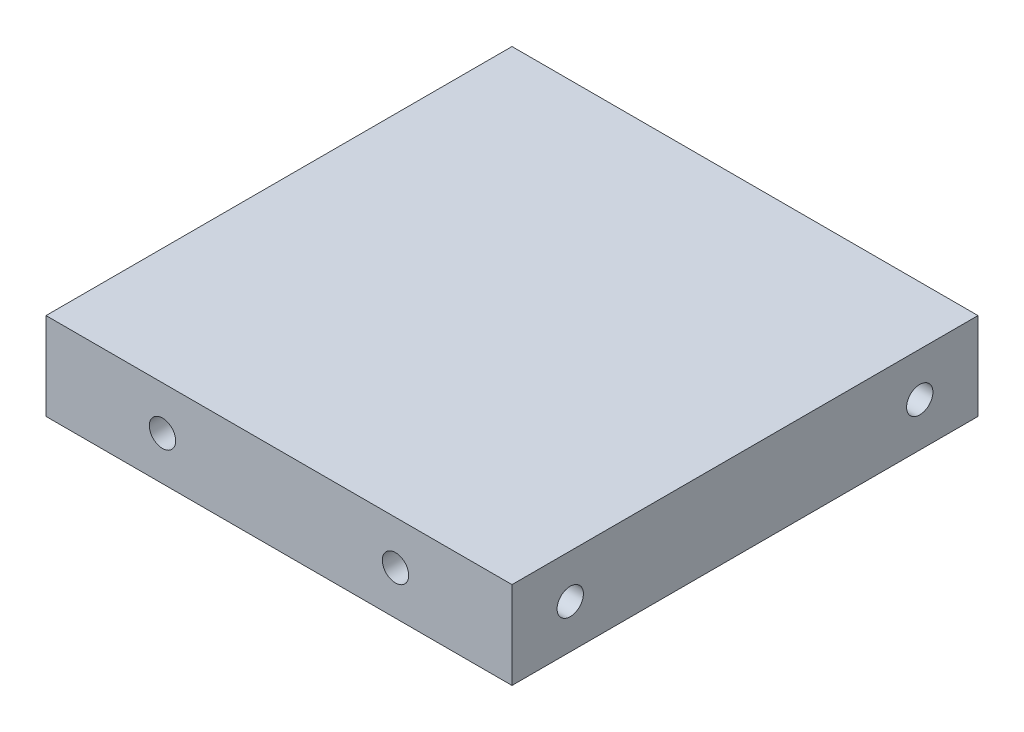
ISO-10303-21;
HEADER;
FILE_DESCRIPTION(('STEP AP214'),'2;1');
FILE_NAME('part.step','',(''),(''),'','','');
FILE_SCHEMA(('AUTOMOTIVE_DESIGN { 1 0 10303 214 1 1 1 1 }'));
ENDSEC;
DATA;
#1=APPLICATION_CONTEXT('core data for automotive mechanical design processes');
#2=APPLICATION_PROTOCOL_DEFINITION('international standard','automotive_design',2000,#1);
#3=PRODUCT_CONTEXT('',#1,'mechanical');
#4=PRODUCT('Part','Part','',(#3));
#5=PRODUCT_RELATED_PRODUCT_CATEGORY('part','',(#4));
#6=PRODUCT_DEFINITION_FORMATION('','',#4);
#7=PRODUCT_DEFINITION_CONTEXT('part definition',#1,'design');
#8=PRODUCT_DEFINITION('design','',#6,#7);
#9=PRODUCT_DEFINITION_SHAPE('','',#8);
#10=(LENGTH_UNIT() NAMED_UNIT(*) SI_UNIT(.MILLI.,.METRE.));
#11=(NAMED_UNIT(*) PLANE_ANGLE_UNIT() SI_UNIT($,.RADIAN.));
#12=(NAMED_UNIT(*) SI_UNIT($,.STERADIAN.) SOLID_ANGLE_UNIT());
#13=UNCERTAINTY_MEASURE_WITH_UNIT(LENGTH_MEASURE(1.E-05),#10,'distance_accuracy_value','');
#14=(GEOMETRIC_REPRESENTATION_CONTEXT(3) GLOBAL_UNCERTAINTY_ASSIGNED_CONTEXT((#13)) GLOBAL_UNIT_ASSIGNED_CONTEXT((#10,
#11,#12)) REPRESENTATION_CONTEXT('',''));
#15=CARTESIAN_POINT('',(0.,0.,0.));
#16=DIRECTION('',(0.,0.,1.));
#17=DIRECTION('',(1.,0.,0.));
#18=AXIS2_PLACEMENT_3D('',#15,#16,#17);
#19=CARTESIAN_POINT('',(-20.,7.5,20.));
#20=DIRECTION('',(1.,0.,0.));
#21=DIRECTION('',(0.,0.,-1.));
#22=AXIS2_PLACEMENT_3D('',#19,#20,#21);
#23=PLANE('',#22);
#24=CARTESIAN_POINT('',(-20.,3.75,-15.));
#25=DIRECTION('',(-1.,0.,0.));
#26=DIRECTION('',(0.,0.,1.));
#27=AXIS2_PLACEMENT_3D('',#24,#25,#26);
#28=CIRCLE('',#27,1.13029999999999);
#29=CARTESIAN_POINT('',(-20.,3.75,-13.8697));
#30=VERTEX_POINT('',#29);
#31=EDGE_CURVE('E157',#30,#30,#28,.T.);
#32=ORIENTED_EDGE('',*,*,#31,.F.);
#33=EDGE_LOOP('',(#32));
#34=FACE_BOUND('',#33,.T.);
#35=CARTESIAN_POINT('',(-20.,3.75000000000001,15.));
#36=DIRECTION('',(-1.,0.,0.));
#37=DIRECTION('',(0.,0.,1.));
#38=AXIS2_PLACEMENT_3D('',#35,#36,#37);
#39=CIRCLE('',#38,1.13029999999999);
#40=CARTESIAN_POINT('',(-20.,3.75000000000001,16.1303));
#41=VERTEX_POINT('',#40);
#42=EDGE_CURVE('E163',#41,#41,#39,.T.);
#43=ORIENTED_EDGE('',*,*,#42,.F.);
#44=EDGE_LOOP('',(#43));
#45=FACE_BOUND('',#44,.T.);
#46=DIRECTION('',(0.,0.,1.));
#47=VECTOR('',#46,1.);
#48=CARTESIAN_POINT('',(-20.,0.,20.));
#49=LINE('',#48,#47);
#50=CARTESIAN_POINT('',(-20.,0.,-20.));
#51=VERTEX_POINT('',#50);
#52=CARTESIAN_POINT('',(-20.,0.,20.));
#53=VERTEX_POINT('',#52);
#54=EDGE_CURVE('E169',#51,#53,#49,.T.);
#55=ORIENTED_EDGE('',*,*,#54,.T.);
#56=DIRECTION('',(0.,-1.,0.));
#57=VECTOR('',#56,1.);
#58=CARTESIAN_POINT('',(-20.,7.5,20.));
#59=LINE('',#58,#57);
#60=CARTESIAN_POINT('',(-20.,7.5,20.));
#61=VERTEX_POINT('',#60);
#62=EDGE_CURVE('E11',#61,#53,#59,.T.);
#63=ORIENTED_EDGE('',*,*,#62,.F.);
#64=DIRECTION('',(0.,0.,1.));
#65=VECTOR('',#64,1.);
#66=CARTESIAN_POINT('',(-20.,7.5,20.));
#67=LINE('',#66,#65);
#68=CARTESIAN_POINT('',(-20.,7.5,-20.));
#69=VERTEX_POINT('',#68);
#70=EDGE_CURVE('E170',#69,#61,#67,.T.);
#71=ORIENTED_EDGE('',*,*,#70,.F.);
#72=DIRECTION('',(0.,-1.,0.));
#73=VECTOR('',#72,1.);
#74=CARTESIAN_POINT('',(-20.,7.5,-20.));
#75=LINE('',#74,#73);
#76=EDGE_CURVE('E176',#69,#51,#75,.T.);
#77=ORIENTED_EDGE('',*,*,#76,.T.);
#78=EDGE_LOOP('',(#55,#63,#71,#77));
#79=FACE_BOUND('',#78,.T.);
#80=ADVANCED_FACE('F40',(#34,#45,#79),#23,.F.);
#81=CARTESIAN_POINT('',(20.,7.5,20.));
#82=DIRECTION('',(0.,0.,-1.));
#83=DIRECTION('',(-1.,0.,0.));
#84=AXIS2_PLACEMENT_3D('',#81,#82,#83);
#85=PLANE('',#84);
#86=CARTESIAN_POINT('',(-10.,3.75,20.));
#87=DIRECTION('',(0.,0.,1.));
#88=DIRECTION('',(1.,0.,0.));
#89=AXIS2_PLACEMENT_3D('',#86,#87,#88);
#90=CIRCLE('',#89,1.13029999999999);
#91=CARTESIAN_POINT('',(-8.86970000000002,3.75,20.));
#92=VERTEX_POINT('',#91);
#93=EDGE_CURVE('E123',#92,#92,#90,.T.);
#94=ORIENTED_EDGE('',*,*,#93,.F.);
#95=EDGE_LOOP('',(#94));
#96=FACE_BOUND('',#95,.T.);
#97=CARTESIAN_POINT('',(9.99999999999999,3.75,20.));
#98=DIRECTION('',(0.,0.,1.));
#99=DIRECTION('',(1.,0.,0.));
#100=AXIS2_PLACEMENT_3D('',#97,#98,#99);
#101=CIRCLE('',#100,1.13029999999999);
#102=CARTESIAN_POINT('',(11.1303,3.75,20.));
#103=VERTEX_POINT('',#102);
#104=EDGE_CURVE('E122',#103,#103,#101,.T.);
#105=ORIENTED_EDGE('',*,*,#104,.F.);
#106=EDGE_LOOP('',(#105));
#107=FACE_BOUND('',#106,.T.);
#108=DIRECTION('',(1.,0.,0.));
#109=VECTOR('',#108,1.);
#110=CARTESIAN_POINT('',(20.,0.,20.));
#111=LINE('',#110,#109);
#112=CARTESIAN_POINT('',(20.,0.,20.));
#113=VERTEX_POINT('',#112);
#114=EDGE_CURVE('E179',#53,#113,#111,.T.);
#115=ORIENTED_EDGE('',*,*,#114,.T.);
#116=DIRECTION('',(0.,-1.,0.));
#117=VECTOR('',#116,1.);
#118=CARTESIAN_POINT('',(20.,7.5,20.));
#119=LINE('',#118,#117);
#120=CARTESIAN_POINT('',(20.,7.5,20.));
#121=VERTEX_POINT('',#120);
#122=EDGE_CURVE('E48',#121,#113,#119,.T.);
#123=ORIENTED_EDGE('',*,*,#122,.F.);
#124=DIRECTION('',(1.,0.,0.));
#125=VECTOR('',#124,1.);
#126=CARTESIAN_POINT('',(20.,7.5,20.));
#127=LINE('',#126,#125);
#128=EDGE_CURVE('E87',#61,#121,#127,.T.);
#129=ORIENTED_EDGE('',*,*,#128,.F.);
#130=ORIENTED_EDGE('',*,*,#62,.T.);
#131=EDGE_LOOP('',(#115,#123,#129,#130));
#132=FACE_BOUND('',#131,.T.);
#133=ADVANCED_FACE('F203',(#96,#107,#132),#85,.F.);
#134=CARTESIAN_POINT('',(20.,7.5,20.));
#135=DIRECTION('',(-1.,0.,0.));
#136=DIRECTION('',(0.,0.,1.));
#137=AXIS2_PLACEMENT_3D('',#134,#135,#136);
#138=PLANE('',#137);
#139=CARTESIAN_POINT('',(20.,3.75000000000001,15.));
#140=DIRECTION('',(1.,0.,0.));
#141=DIRECTION('',(0.,0.,-1.));
#142=AXIS2_PLACEMENT_3D('',#139,#140,#141);
#143=CIRCLE('',#142,1.13029999999999);
#144=CARTESIAN_POINT('',(20.,3.75000000000001,13.8697));
#145=VERTEX_POINT('',#144);
#146=EDGE_CURVE('E145',#145,#145,#143,.T.);
#147=ORIENTED_EDGE('',*,*,#146,.F.);
#148=EDGE_LOOP('',(#147));
#149=FACE_BOUND('',#148,.T.);
#150=CARTESIAN_POINT('',(20.,3.75,-15.));
#151=DIRECTION('',(1.,0.,0.));
#152=DIRECTION('',(0.,0.,-1.));
#153=AXIS2_PLACEMENT_3D('',#150,#151,#152);
#154=CIRCLE('',#153,1.13029999999999);
#155=CARTESIAN_POINT('',(20.,3.75,-16.1303));
#156=VERTEX_POINT('',#155);
#157=EDGE_CURVE('E151',#156,#156,#154,.T.);
#158=ORIENTED_EDGE('',*,*,#157,.F.);
#159=EDGE_LOOP('',(#158));
#160=FACE_BOUND('',#159,.T.);
#161=DIRECTION('',(0.,0.,-1.));
#162=VECTOR('',#161,1.);
#163=CARTESIAN_POINT('',(20.,0.,20.));
#164=LINE('',#163,#162);
#165=CARTESIAN_POINT('',(20.,0.,-20.));
#166=VERTEX_POINT('',#165);
#167=EDGE_CURVE('E74',#113,#166,#164,.T.);
#168=ORIENTED_EDGE('',*,*,#167,.T.);
#169=DIRECTION('',(0.,-1.,0.));
#170=VECTOR('',#169,1.);
#171=CARTESIAN_POINT('',(20.,7.5,-20.));
#172=LINE('',#171,#170);
#173=CARTESIAN_POINT('',(20.,7.5,-20.));
#174=VERTEX_POINT('',#173);
#175=EDGE_CURVE('E184',#174,#166,#172,.T.);
#176=ORIENTED_EDGE('',*,*,#175,.F.);
#177=DIRECTION('',(0.,0.,-1.));
#178=VECTOR('',#177,1.);
#179=CARTESIAN_POINT('',(20.,7.5,20.));
#180=LINE('',#179,#178);
#181=EDGE_CURVE('E173',#121,#174,#180,.T.);
#182=ORIENTED_EDGE('',*,*,#181,.F.);
#183=ORIENTED_EDGE('',*,*,#122,.T.);
#184=EDGE_LOOP('',(#168,#176,#182,#183));
#185=FACE_BOUND('',#184,.T.);
#186=ADVANCED_FACE('F186',(#149,#160,#185),#138,.F.);
#187=CARTESIAN_POINT('',(20.,7.5,-20.));
#188=DIRECTION('',(0.,0.,1.));
#189=DIRECTION('',(1.,0.,0.));
#190=AXIS2_PLACEMENT_3D('',#187,#188,#189);
#191=PLANE('',#190);
#192=CARTESIAN_POINT('',(9.99999999999999,3.75,-20.));
#193=DIRECTION('',(0.,0.,-1.));
#194=DIRECTION('',(-1.,0.,0.));
#195=AXIS2_PLACEMENT_3D('',#192,#193,#194);
#196=CIRCLE('',#195,1.1303);
#197=CARTESIAN_POINT('',(8.86969999999999,3.75,-20.));
#198=VERTEX_POINT('',#197);
#199=EDGE_CURVE('E133',#198,#198,#196,.T.);
#200=ORIENTED_EDGE('',*,*,#199,.F.);
#201=EDGE_LOOP('',(#200));
#202=FACE_BOUND('',#201,.T.);
#203=CARTESIAN_POINT('',(-10.,3.75,-20.));
#204=DIRECTION('',(0.,0.,-1.));
#205=DIRECTION('',(-1.,0.,0.));
#206=AXIS2_PLACEMENT_3D('',#203,#204,#205);
#207=CIRCLE('',#206,1.1303);
#208=CARTESIAN_POINT('',(-11.1303,3.75,-20.));
#209=VERTEX_POINT('',#208);
#210=EDGE_CURVE('E139',#209,#209,#207,.T.);
#211=ORIENTED_EDGE('',*,*,#210,.F.);
#212=EDGE_LOOP('',(#211));
#213=FACE_BOUND('',#212,.T.);
#214=DIRECTION('',(-1.,0.,0.));
#215=VECTOR('',#214,1.);
#216=CARTESIAN_POINT('',(20.,0.,-20.));
#217=LINE('',#216,#215);
#218=EDGE_CURVE('E80',#166,#51,#217,.T.);
#219=ORIENTED_EDGE('',*,*,#218,.T.);
#220=ORIENTED_EDGE('',*,*,#76,.F.);
#221=DIRECTION('',(-1.,0.,0.));
#222=VECTOR('',#221,1.);
#223=CARTESIAN_POINT('',(20.,7.5,-20.));
#224=LINE('',#223,#222);
#225=EDGE_CURVE('E56',#174,#69,#224,.T.);
#226=ORIENTED_EDGE('',*,*,#225,.F.);
#227=ORIENTED_EDGE('',*,*,#175,.T.);
#228=EDGE_LOOP('',(#219,#220,#226,#227));
#229=FACE_BOUND('',#228,.T.);
#230=ADVANCED_FACE('F193',(#202,#213,#229),#191,.F.);
#231=CARTESIAN_POINT('',(0.,7.5,0.));
#232=DIRECTION('',(0.,1.,0.));
#233=DIRECTION('',(0.,0.,1.));
#234=AXIS2_PLACEMENT_3D('',#231,#232,#233);
#235=PLANE('',#234);
#236=ORIENTED_EDGE('',*,*,#70,.T.);
#237=ORIENTED_EDGE('',*,*,#128,.T.);
#238=ORIENTED_EDGE('',*,*,#181,.T.);
#239=ORIENTED_EDGE('',*,*,#225,.T.);
#240=EDGE_LOOP('',(#236,#237,#238,#239));
#241=FACE_BOUND('',#240,.T.);
#242=ADVANCED_FACE('F195',(#241),#235,.T.);
#243=CARTESIAN_POINT('',(0.,0.,0.));
#244=DIRECTION('',(0.,1.,0.));
#245=DIRECTION('',(0.,0.,1.));
#246=AXIS2_PLACEMENT_3D('',#243,#244,#245);
#247=PLANE('',#246);
#248=ORIENTED_EDGE('',*,*,#54,.F.);
#249=ORIENTED_EDGE('',*,*,#218,.F.);
#250=ORIENTED_EDGE('',*,*,#167,.F.);
#251=ORIENTED_EDGE('',*,*,#114,.F.);
#252=EDGE_LOOP('',(#248,#249,#250,#251));
#253=FACE_BOUND('',#252,.T.);
#254=ADVANCED_FACE('F189',(#253),#247,.F.);
#255=CARTESIAN_POINT('',(-12.4,3.75000000000001,15.));
#256=DIRECTION('',(-1.,0.,0.));
#257=DIRECTION('',(0.,0.,1.));
#258=AXIS2_PLACEMENT_3D('',#255,#256,#257);
#259=CONICAL_SURFACE('',#258,1.1303,1.02974425867665);
#260=CARTESIAN_POINT('',(-11.7208472423131,3.75,15.));
#261=VERTEX_POINT('',#260);
#262=VERTEX_LOOP('',#261);
#263=FACE_BOUND('',#262,.T.);
#264=CARTESIAN_POINT('',(-12.4,3.75000000000001,15.));
#265=DIRECTION('',(-1.,0.,0.));
#266=DIRECTION('',(0.,0.,1.));
#267=AXIS2_PLACEMENT_3D('',#264,#265,#266);
#268=CIRCLE('',#267,1.1303);
#269=CARTESIAN_POINT('',(-12.4,3.75000000000001,16.1303));
#270=VERTEX_POINT('',#269);
#271=EDGE_CURVE('E166',#270,#270,#268,.T.);
#272=ORIENTED_EDGE('',*,*,#271,.T.);
#273=EDGE_LOOP('',(#272));
#274=FACE_BOUND('',#273,.T.);
#275=ADVANCED_FACE('F222',(#263,#274),#259,.F.);
#276=CARTESIAN_POINT('',(-20.,3.75000000000001,15.));
#277=DIRECTION('',(-1.,0.,0.));
#278=DIRECTION('',(0.,0.,1.));
#279=AXIS2_PLACEMENT_3D('',#276,#277,#278);
#280=CYLINDRICAL_SURFACE('',#279,1.13029999999999);
#281=ORIENTED_EDGE('',*,*,#271,.F.);
#282=EDGE_LOOP('',(#281));
#283=FACE_BOUND('',#282,.T.);
#284=ORIENTED_EDGE('',*,*,#42,.T.);
#285=EDGE_LOOP('',(#284));
#286=FACE_BOUND('',#285,.T.);
#287=ADVANCED_FACE('F219',(#283,#286),#280,.F.);
#288=CARTESIAN_POINT('',(-12.4,3.75,-15.));
#289=DIRECTION('',(-1.,0.,0.));
#290=DIRECTION('',(0.,0.,1.));
#291=AXIS2_PLACEMENT_3D('',#288,#289,#290);
#292=CONICAL_SURFACE('',#291,1.1303,1.02974425867665);
#293=CARTESIAN_POINT('',(-11.7208472423131,3.75,-15.));
#294=VERTEX_POINT('',#293);
#295=VERTEX_LOOP('',#294);
#296=FACE_BOUND('',#295,.T.);
#297=CARTESIAN_POINT('',(-12.4,3.75,-15.));
#298=DIRECTION('',(-1.,0.,0.));
#299=DIRECTION('',(0.,0.,1.));
#300=AXIS2_PLACEMENT_3D('',#297,#298,#299);
#301=CIRCLE('',#300,1.1303);
#302=CARTESIAN_POINT('',(-12.4,3.75,-13.8697));
#303=VERTEX_POINT('',#302);
#304=EDGE_CURVE('E160',#303,#303,#301,.T.);
#305=ORIENTED_EDGE('',*,*,#304,.T.);
#306=EDGE_LOOP('',(#305));
#307=FACE_BOUND('',#306,.T.);
#308=ADVANCED_FACE('F221',(#296,#307),#292,.F.);
#309=CARTESIAN_POINT('',(-20.,3.75,-15.));
#310=DIRECTION('',(-1.,0.,0.));
#311=DIRECTION('',(0.,0.,1.));
#312=AXIS2_PLACEMENT_3D('',#309,#310,#311);
#313=CYLINDRICAL_SURFACE('',#312,1.13029999999999);
#314=ORIENTED_EDGE('',*,*,#304,.F.);
#315=EDGE_LOOP('',(#314));
#316=FACE_BOUND('',#315,.T.);
#317=ORIENTED_EDGE('',*,*,#31,.T.);
#318=EDGE_LOOP('',(#317));
#319=FACE_BOUND('',#318,.T.);
#320=ADVANCED_FACE('F229',(#316,#319),#313,.F.);
#321=CARTESIAN_POINT('',(12.4,3.75,-15.));
#322=DIRECTION('',(1.,0.,0.));
#323=DIRECTION('',(0.,0.,-1.));
#324=AXIS2_PLACEMENT_3D('',#321,#322,#323);
#325=CONICAL_SURFACE('',#324,1.13029999999999,1.02974425867665);
#326=CARTESIAN_POINT('',(11.7208472423132,3.75,-15.));
#327=VERTEX_POINT('',#326);
#328=VERTEX_LOOP('',#327);
#329=FACE_BOUND('',#328,.T.);
#330=CARTESIAN_POINT('',(12.4,3.75,-15.));
#331=DIRECTION('',(1.,0.,0.));
#332=DIRECTION('',(0.,0.,-1.));
#333=AXIS2_PLACEMENT_3D('',#330,#331,#332);
#334=CIRCLE('',#333,1.13029999999999);
#335=CARTESIAN_POINT('',(12.4,3.75,-16.1303));
#336=VERTEX_POINT('',#335);
#337=EDGE_CURVE('E154',#336,#336,#334,.T.);
#338=ORIENTED_EDGE('',*,*,#337,.T.);
#339=EDGE_LOOP('',(#338));
#340=FACE_BOUND('',#339,.T.);
#341=ADVANCED_FACE('F273',(#329,#340),#325,.F.);
#342=CARTESIAN_POINT('',(20.,3.75,-15.));
#343=DIRECTION('',(1.,0.,0.));
#344=DIRECTION('',(0.,0.,-1.));
#345=AXIS2_PLACEMENT_3D('',#342,#343,#344);
#346=CYLINDRICAL_SURFACE('',#345,1.13029999999999);
#347=ORIENTED_EDGE('',*,*,#337,.F.);
#348=EDGE_LOOP('',(#347));
#349=FACE_BOUND('',#348,.T.);
#350=ORIENTED_EDGE('',*,*,#157,.T.);
#351=EDGE_LOOP('',(#350));
#352=FACE_BOUND('',#351,.T.);
#353=ADVANCED_FACE('F295',(#349,#352),#346,.F.);
#354=CARTESIAN_POINT('',(12.4,3.75000000000001,15.));
#355=DIRECTION('',(1.,0.,0.));
#356=DIRECTION('',(0.,0.,-1.));
#357=AXIS2_PLACEMENT_3D('',#354,#355,#356);
#358=CONICAL_SURFACE('',#357,1.13029999999999,1.02974425867665);
#359=CARTESIAN_POINT('',(11.7208472423132,3.75000000000001,15.));
#360=VERTEX_POINT('',#359);
#361=VERTEX_LOOP('',#360);
#362=FACE_BOUND('',#361,.T.);
#363=CARTESIAN_POINT('',(12.4,3.75000000000001,15.));
#364=DIRECTION('',(1.,0.,0.));
#365=DIRECTION('',(0.,0.,-1.));
#366=AXIS2_PLACEMENT_3D('',#363,#364,#365);
#367=CIRCLE('',#366,1.13029999999999);
#368=CARTESIAN_POINT('',(12.4,3.75000000000001,13.8697));
#369=VERTEX_POINT('',#368);
#370=EDGE_CURVE('E148',#369,#369,#367,.T.);
#371=ORIENTED_EDGE('',*,*,#370,.T.);
#372=EDGE_LOOP('',(#371));
#373=FACE_BOUND('',#372,.T.);
#374=ADVANCED_FACE('F305',(#362,#373),#358,.F.);
#375=CARTESIAN_POINT('',(20.,3.75000000000001,15.));
#376=DIRECTION('',(1.,0.,0.));
#377=DIRECTION('',(0.,0.,-1.));
#378=AXIS2_PLACEMENT_3D('',#375,#376,#377);
#379=CYLINDRICAL_SURFACE('',#378,1.13029999999999);
#380=ORIENTED_EDGE('',*,*,#370,.F.);
#381=EDGE_LOOP('',(#380));
#382=FACE_BOUND('',#381,.T.);
#383=ORIENTED_EDGE('',*,*,#146,.T.);
#384=EDGE_LOOP('',(#383));
#385=FACE_BOUND('',#384,.T.);
#386=ADVANCED_FACE('F316',(#382,#385),#379,.F.);
#387=CARTESIAN_POINT('',(-10.,3.75,-12.4));
#388=DIRECTION('',(0.,0.,-1.));
#389=DIRECTION('',(-1.,0.,0.));
#390=AXIS2_PLACEMENT_3D('',#387,#388,#389);
#391=CONICAL_SURFACE('',#390,1.1303,1.02974425867665);
#392=CARTESIAN_POINT('',(-10.,3.75,-11.7208472423132));
#393=VERTEX_POINT('',#392);
#394=VERTEX_LOOP('',#393);
#395=FACE_BOUND('',#394,.T.);
#396=CARTESIAN_POINT('',(-10.,3.75,-12.4));
#397=DIRECTION('',(0.,0.,-1.));
#398=DIRECTION('',(-1.,0.,0.));
#399=AXIS2_PLACEMENT_3D('',#396,#397,#398);
#400=CIRCLE('',#399,1.1303);
#401=CARTESIAN_POINT('',(-11.1303,3.75,-12.4));
#402=VERTEX_POINT('',#401);
#403=EDGE_CURVE('E142',#402,#402,#400,.T.);
#404=ORIENTED_EDGE('',*,*,#403,.T.);
#405=EDGE_LOOP('',(#404));
#406=FACE_BOUND('',#405,.T.);
#407=ADVANCED_FACE('F326',(#395,#406),#391,.F.);
#408=CARTESIAN_POINT('',(-10.,3.75,-20.));
#409=DIRECTION('',(0.,0.,-1.));
#410=DIRECTION('',(-1.,0.,0.));
#411=AXIS2_PLACEMENT_3D('',#408,#409,#410);
#412=CYLINDRICAL_SURFACE('',#411,1.1303);
#413=ORIENTED_EDGE('',*,*,#403,.F.);
#414=EDGE_LOOP('',(#413));
#415=FACE_BOUND('',#414,.T.);
#416=ORIENTED_EDGE('',*,*,#210,.T.);
#417=EDGE_LOOP('',(#416));
#418=FACE_BOUND('',#417,.T.);
#419=ADVANCED_FACE('F346',(#415,#418),#412,.F.);
#420=CARTESIAN_POINT('',(9.99999999999999,3.75,-12.4));
#421=DIRECTION('',(0.,0.,-1.));
#422=DIRECTION('',(-1.,0.,0.));
#423=AXIS2_PLACEMENT_3D('',#420,#421,#422);
#424=CONICAL_SURFACE('',#423,1.1303,1.02974425867665);
#425=CARTESIAN_POINT('',(9.99999999999999,3.75,-11.7208472423132));
#426=VERTEX_POINT('',#425);
#427=VERTEX_LOOP('',#426);
#428=FACE_BOUND('',#427,.T.);
#429=CARTESIAN_POINT('',(9.99999999999999,3.75,-12.4));
#430=DIRECTION('',(0.,0.,-1.));
#431=DIRECTION('',(-1.,0.,0.));
#432=AXIS2_PLACEMENT_3D('',#429,#430,#431);
#433=CIRCLE('',#432,1.1303);
#434=CARTESIAN_POINT('',(8.86969999999999,3.75,-12.4));
#435=VERTEX_POINT('',#434);
#436=EDGE_CURVE('E136',#435,#435,#433,.T.);
#437=ORIENTED_EDGE('',*,*,#436,.T.);
#438=EDGE_LOOP('',(#437));
#439=FACE_BOUND('',#438,.T.);
#440=ADVANCED_FACE('F356',(#428,#439),#424,.F.);
#441=CARTESIAN_POINT('',(9.99999999999999,3.75,-20.));
#442=DIRECTION('',(0.,0.,-1.));
#443=DIRECTION('',(-1.,0.,0.));
#444=AXIS2_PLACEMENT_3D('',#441,#442,#443);
#445=CYLINDRICAL_SURFACE('',#444,1.1303);
#446=ORIENTED_EDGE('',*,*,#436,.F.);
#447=EDGE_LOOP('',(#446));
#448=FACE_BOUND('',#447,.T.);
#449=ORIENTED_EDGE('',*,*,#199,.T.);
#450=EDGE_LOOP('',(#449));
#451=FACE_BOUND('',#450,.T.);
#452=ADVANCED_FACE('F367',(#448,#451),#445,.F.);
#453=CARTESIAN_POINT('',(9.99999999999999,3.75,12.4));
#454=DIRECTION('',(0.,0.,1.));
#455=DIRECTION('',(1.,0.,0.));
#456=AXIS2_PLACEMENT_3D('',#453,#454,#455);
#457=CONICAL_SURFACE('',#456,1.13029999999999,1.02974425867665);
#458=CARTESIAN_POINT('',(9.99999999999999,3.75,11.7208472423132));
#459=VERTEX_POINT('',#458);
#460=VERTEX_LOOP('',#459);
#461=FACE_BOUND('',#460,.T.);
#462=CARTESIAN_POINT('',(9.99999999999999,3.75,12.4));
#463=DIRECTION('',(0.,0.,1.));
#464=DIRECTION('',(1.,0.,0.));
#465=AXIS2_PLACEMENT_3D('',#462,#463,#464);
#466=CIRCLE('',#465,1.13029999999999);
#467=CARTESIAN_POINT('',(11.1303,3.75,12.4));
#468=VERTEX_POINT('',#467);
#469=EDGE_CURVE('E126',#468,#468,#466,.T.);
#470=ORIENTED_EDGE('',*,*,#469,.T.);
#471=EDGE_LOOP('',(#470));
#472=FACE_BOUND('',#471,.T.);
#473=ADVANCED_FACE('F377',(#461,#472),#457,.F.);
#474=CARTESIAN_POINT('',(9.99999999999999,3.75,20.));
#475=DIRECTION('',(0.,0.,1.));
#476=DIRECTION('',(1.,0.,0.));
#477=AXIS2_PLACEMENT_3D('',#474,#475,#476);
#478=CYLINDRICAL_SURFACE('',#477,1.13029999999999);
#479=ORIENTED_EDGE('',*,*,#469,.F.);
#480=EDGE_LOOP('',(#479));
#481=FACE_BOUND('',#480,.T.);
#482=ORIENTED_EDGE('',*,*,#104,.T.);
#483=EDGE_LOOP('',(#482));
#484=FACE_BOUND('',#483,.T.);
#485=ADVANCED_FACE('F116',(#481,#484),#478,.F.);
#486=CARTESIAN_POINT('',(-10.,3.75,12.4));
#487=DIRECTION('',(0.,0.,1.));
#488=DIRECTION('',(1.,0.,0.));
#489=AXIS2_PLACEMENT_3D('',#486,#487,#488);
#490=CONICAL_SURFACE('',#489,1.13029999999999,1.02974425867665);
#491=CARTESIAN_POINT('',(-10.,3.75,11.7208472423132));
#492=VERTEX_POINT('',#491);
#493=VERTEX_LOOP('',#492);
#494=FACE_BOUND('',#493,.T.);
#495=CARTESIAN_POINT('',(-10.,3.75,12.4));
#496=DIRECTION('',(0.,0.,1.));
#497=DIRECTION('',(1.,0.,0.));
#498=AXIS2_PLACEMENT_3D('',#495,#496,#497);
#499=CIRCLE('',#498,1.13029999999999);
#500=CARTESIAN_POINT('',(-8.86970000000002,3.75,12.4));
#501=VERTEX_POINT('',#500);
#502=EDGE_CURVE('E120',#501,#501,#499,.T.);
#503=ORIENTED_EDGE('',*,*,#502,.T.);
#504=EDGE_LOOP('',(#503));
#505=FACE_BOUND('',#504,.T.);
#506=ADVANCED_FACE('F112',(#494,#505),#490,.F.);
#507=CARTESIAN_POINT('',(-10.,3.75,20.));
#508=DIRECTION('',(0.,0.,1.));
#509=DIRECTION('',(1.,0.,0.));
#510=AXIS2_PLACEMENT_3D('',#507,#508,#509);
#511=CYLINDRICAL_SURFACE('',#510,1.13029999999999);
#512=ORIENTED_EDGE('',*,*,#502,.F.);
#513=EDGE_LOOP('',(#512));
#514=FACE_BOUND('',#513,.T.);
#515=ORIENTED_EDGE('',*,*,#93,.T.);
#516=EDGE_LOOP('',(#515));
#517=FACE_BOUND('',#516,.T.);
#518=ADVANCED_FACE('F115',(#514,#517),#511,.F.);
#519=CLOSED_SHELL('',(#80,#133,#186,#230,#242,#254,#275,#287,#308,#320,#341,#353,#374,#386,#407,
#419,#440,#452,#473,#485,#506,#518));
#520=MANIFOLD_SOLID_BREP('B2',#519);
#521=ADVANCED_BREP_SHAPE_REPRESENTATION('',(#18,#520),#14);
#522=SHAPE_DEFINITION_REPRESENTATION(#9,#521);
ENDSEC;
END-ISO-10303-21;
